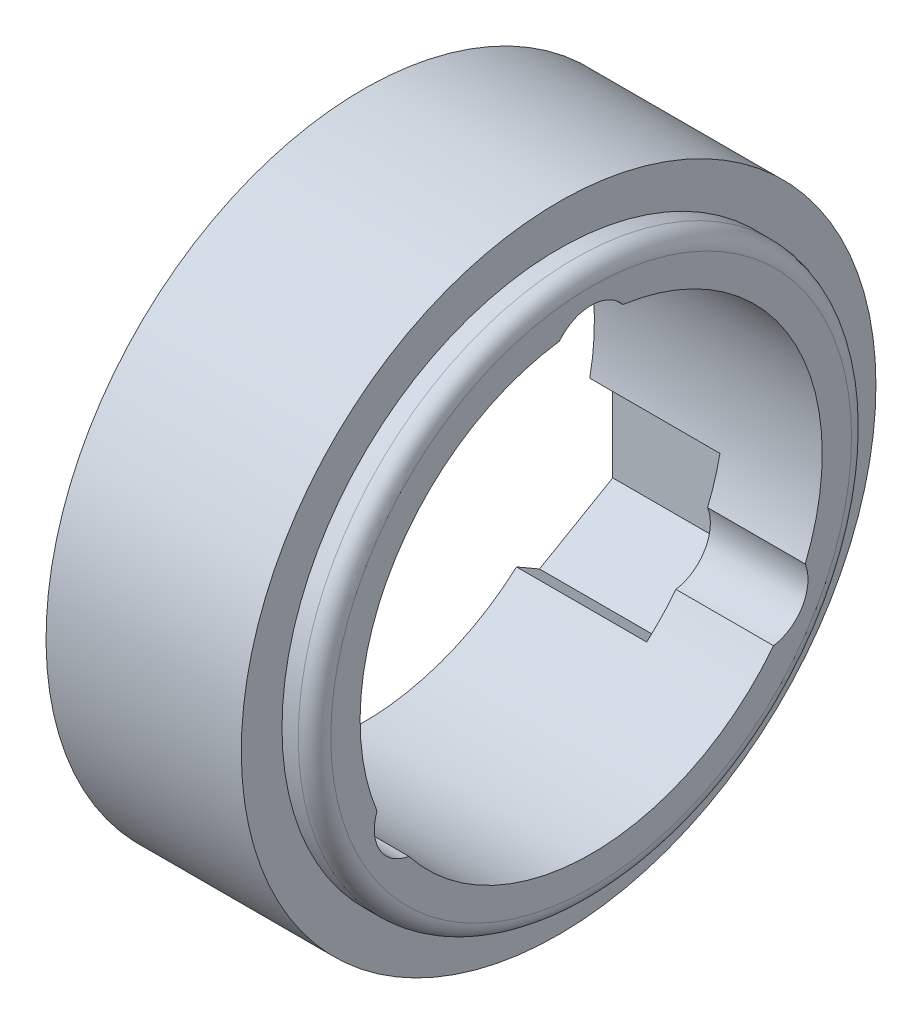
ISO-10303-21;
HEADER;
FILE_DESCRIPTION(('STEP AP214'),'2;1');
FILE_NAME('part.step','',(''),(''),'','','');
FILE_SCHEMA(('AUTOMOTIVE_DESIGN { 1 0 10303 214 1 1 1 1 }'));
ENDSEC;
DATA;
#1=APPLICATION_CONTEXT('core data for automotive mechanical design processes');
#2=APPLICATION_PROTOCOL_DEFINITION('international standard','automotive_design',2000,#1);
#3=PRODUCT_CONTEXT('',#1,'mechanical');
#4=PRODUCT('Part','Part','',(#3));
#5=PRODUCT_RELATED_PRODUCT_CATEGORY('part','',(#4));
#6=PRODUCT_DEFINITION_FORMATION('','',#4);
#7=PRODUCT_DEFINITION_CONTEXT('part definition',#1,'design');
#8=PRODUCT_DEFINITION('design','',#6,#7);
#9=PRODUCT_DEFINITION_SHAPE('','',#8);
#10=(LENGTH_UNIT() NAMED_UNIT(*) SI_UNIT(.MILLI.,.METRE.));
#11=(NAMED_UNIT(*) PLANE_ANGLE_UNIT() SI_UNIT($,.RADIAN.));
#12=(NAMED_UNIT(*) SI_UNIT($,.STERADIAN.) SOLID_ANGLE_UNIT());
#13=UNCERTAINTY_MEASURE_WITH_UNIT(LENGTH_MEASURE(1.E-05),#10,'distance_accuracy_value','');
#14=(GEOMETRIC_REPRESENTATION_CONTEXT(3) GLOBAL_UNCERTAINTY_ASSIGNED_CONTEXT((#13)) GLOBAL_UNIT_ASSIGNED_CONTEXT((#10,
#11,#12)) REPRESENTATION_CONTEXT('',''));
#15=CARTESIAN_POINT('',(0.,0.,0.));
#16=DIRECTION('',(0.,0.,1.));
#17=DIRECTION('',(1.,0.,0.));
#18=AXIS2_PLACEMENT_3D('',#15,#16,#17);
#19=CARTESIAN_POINT('',(97.,16.,-3.));
#20=DIRECTION('',(-1.,0.,0.));
#21=DIRECTION('',(0.,0.,1.));
#22=AXIS2_PLACEMENT_3D('',#19,#20,#21);
#23=CYLINDRICAL_SURFACE('',#22,8.5);
#24=CARTESIAN_POINT('',(96.,16.,-3.));
#25=DIRECTION('',(-1.,0.,0.));
#26=DIRECTION('',(0.,0.,1.));
#27=AXIS2_PLACEMENT_3D('',#24,#25,#26);
#28=CIRCLE('',#27,8.5);
#29=CARTESIAN_POINT('',(96.,16.,-11.5));
#30=VERTEX_POINT('',#29);
#31=EDGE_CURVE('E272',#30,#30,#28,.T.);
#32=ORIENTED_EDGE('',*,*,#31,.F.);
#33=DIRECTION('',(1.,0.,0.));
#34=VECTOR('',#33,1.);
#35=CARTESIAN_POINT('',(97.,16.,-11.5));
#36=LINE('',#35,#34);
#37=CARTESIAN_POINT('',(96.5,16.,-11.5));
#38=VERTEX_POINT('',#37);
#39=EDGE_CURVE('E10',#30,#38,#36,.T.);
#40=ORIENTED_EDGE('',*,*,#39,.T.);
#41=CARTESIAN_POINT('',(96.5,16.,-3.));
#42=DIRECTION('',(1.,0.,0.));
#43=DIRECTION('',(0.,0.,1.));
#44=AXIS2_PLACEMENT_3D('',#41,#42,#43);
#45=CIRCLE('',#44,8.5);
#46=EDGE_CURVE('E271',#38,#38,#45,.T.);
#47=ORIENTED_EDGE('',*,*,#46,.F.);
#48=ORIENTED_EDGE('',*,*,#39,.F.);
#49=EDGE_LOOP('',(#32,#40,#47,#48));
#50=FACE_BOUND('',#49,.T.);
#51=ADVANCED_FACE('F16',(#50),#23,.T.);
#52=CARTESIAN_POINT('',(96.5,16.,-3.));
#53=DIRECTION('',(-1.,0.,0.));
#54=DIRECTION('',(0.,0.,1.));
#55=AXIS2_PLACEMENT_3D('',#52,#53,#54);
#56=TOROIDAL_SURFACE('',#55,8.,0.5);
#57=ORIENTED_EDGE('',*,*,#46,.T.);
#58=CARTESIAN_POINT('',(96.5,16.,-11.));
#59=DIRECTION('',(0.,-1.,0.));
#60=DIRECTION('',(0.,0.,-1.));
#61=AXIS2_PLACEMENT_3D('',#58,#59,#60);
#62=CIRCLE('',#61,0.5);
#63=CARTESIAN_POINT('',(97.,16.,-11.));
#64=VERTEX_POINT('',#63);
#65=EDGE_CURVE('E27',#38,#64,#62,.T.);
#66=ORIENTED_EDGE('',*,*,#65,.T.);
#67=CARTESIAN_POINT('',(97.,16.,-3.));
#68=DIRECTION('',(-1.,0.,0.));
#69=DIRECTION('',(0.,0.,1.));
#70=AXIS2_PLACEMENT_3D('',#67,#68,#69);
#71=CIRCLE('',#70,8.);
#72=EDGE_CURVE('E359',#64,#64,#71,.T.);
#73=ORIENTED_EDGE('',*,*,#72,.T.);
#74=ORIENTED_EDGE('',*,*,#65,.F.);
#75=EDGE_LOOP('',(#57,#66,#73,#74));
#76=FACE_BOUND('',#75,.T.);
#77=ADVANCED_FACE('F553',(#76),#56,.T.);
#78=CARTESIAN_POINT('',(96.,16.,-3.));
#79=DIRECTION('',(-1.,0.,0.));
#80=DIRECTION('',(0.,-0.978362824766285,0.206896551724132));
#81=AXIS2_PLACEMENT_3D('',#78,#79,#80);
#82=CYLINDRICAL_SURFACE('',#81,9.74999999999989);
#83=CARTESIAN_POINT('',(90.,16.,-3.));
#84=DIRECTION('',(-1.,0.,0.));
#85=DIRECTION('',(0.,-0.978362824766285,0.206896551724132));
#86=AXIS2_PLACEMENT_3D('',#83,#84,#85);
#87=CIRCLE('',#86,9.74999999999989);
#88=CARTESIAN_POINT('',(90.,25.122543751513,0.441176470588228));
#89=VERTEX_POINT('',#88);
#90=CARTESIAN_POINT('',(90.,25.5390375414712,-5.01724137931027));
#91=VERTEX_POINT('',#90);
#92=EDGE_CURVE('E266',#89,#91,#87,.T.);
#93=ORIENTED_EDGE('',*,*,#92,.F.);
#94=CARTESIAN_POINT('',(90.,16.,-3.));
#95=DIRECTION('',(-1.,0.,0.));
#96=DIRECTION('',(0.,-0.978362824766285,0.206896551724132));
#97=AXIS2_PLACEMENT_3D('',#94,#95,#96);
#98=CIRCLE('',#97,9.74999999999989);
#99=EDGE_CURVE('E274',#91,#89,#98,.T.);
#100=ORIENTED_EDGE('',*,*,#99,.F.);
#101=DIRECTION('',(1.,0.,0.));
#102=VECTOR('',#101,1.);
#103=CARTESIAN_POINT('',(96.,25.5390375414712,-5.01724137931027));
#104=LINE('',#103,#102);
#105=CARTESIAN_POINT('',(96.,25.5390375414712,-5.01724137931027));
#106=VERTEX_POINT('',#105);
#107=EDGE_CURVE('E262',#91,#106,#104,.T.);
#108=ORIENTED_EDGE('',*,*,#107,.T.);
#109=CARTESIAN_POINT('',(96.,16.,-3.));
#110=DIRECTION('',(-1.,0.,0.));
#111=DIRECTION('',(0.,-0.978362824766285,0.206896551724132));
#112=AXIS2_PLACEMENT_3D('',#109,#110,#111);
#113=CIRCLE('',#112,9.74999999999989);
#114=CARTESIAN_POINT('',(96.,25.122543751513,0.441176470588228));
#115=VERTEX_POINT('',#114);
#116=EDGE_CURVE('E308',#106,#115,#113,.T.);
#117=ORIENTED_EDGE('',*,*,#116,.T.);
#118=CARTESIAN_POINT('',(96.,16.,-3.));
#119=DIRECTION('',(-1.,0.,0.));
#120=DIRECTION('',(0.,-0.978362824766285,0.206896551724132));
#121=AXIS2_PLACEMENT_3D('',#118,#119,#120);
#122=CIRCLE('',#121,9.74999999999989);
#123=EDGE_CURVE('E268',#115,#106,#122,.T.);
#124=ORIENTED_EDGE('',*,*,#123,.T.);
#125=ORIENTED_EDGE('',*,*,#107,.F.);
#126=EDGE_LOOP('',(#93,#100,#108,#117,#124,#125));
#127=FACE_BOUND('',#126,.T.);
#128=ADVANCED_FACE('F264',(#127),#82,.T.);
#129=CARTESIAN_POINT('',(96.,16.,-3.));
#130=DIRECTION('',(-1.,0.,0.));
#131=DIRECTION('',(0.,1.,0.));
#132=AXIS2_PLACEMENT_3D('',#129,#130,#131);
#133=PLANE('',#132);
#134=ORIENTED_EDGE('',*,*,#31,.T.);
#135=EDGE_LOOP('',(#134));
#136=FACE_BOUND('',#135,.T.);
#137=ORIENTED_EDGE('',*,*,#123,.F.);
#138=ORIENTED_EDGE('',*,*,#116,.F.);
#139=EDGE_LOOP('',(#137,#138));
#140=FACE_BOUND('',#139,.T.);
#141=ADVANCED_FACE('F609',(#136,#140),#133,.F.);
#142=CARTESIAN_POINT('',(94.,22.25,-3.));
#143=DIRECTION('',(-1.,0.,0.));
#144=DIRECTION('',(0.,0.,1.));
#145=AXIS2_PLACEMENT_3D('',#142,#143,#144);
#146=PLANE('',#145);
#147=CARTESIAN_POINT('',(94.,16.,-3.));
#148=DIRECTION('',(1.,0.,0.));
#149=DIRECTION('',(0.,0.,-1.));
#150=AXIS2_PLACEMENT_3D('',#147,#148,#149);
#151=CIRCLE('',#150,7.1);
#152=CARTESIAN_POINT('',(94.,22.7340552418287,-5.25));
#153=VERTEX_POINT('',#152);
#154=CARTESIAN_POINT('',(94.,23.0328,-3.97453792127345));
#155=VERTEX_POINT('',#154);
#156=EDGE_CURVE('E464',#153,#155,#151,.T.);
#157=ORIENTED_EDGE('',*,*,#156,.T.);
#158=CARTESIAN_POINT('',(94.,22.25,-3.));
#159=DIRECTION('',(1.,0.,0.));
#160=DIRECTION('',(0.,0.,1.));
#161=AXIS2_PLACEMENT_3D('',#158,#159,#160);
#162=CIRCLE('',#161,1.25);
#163=CARTESIAN_POINT('',(94.,23.0328,-2.02546207872654));
#164=VERTEX_POINT('',#163);
#165=EDGE_CURVE('E287',#155,#164,#162,.T.);
#166=ORIENTED_EDGE('',*,*,#165,.T.);
#167=CARTESIAN_POINT('',(94.,16.,-3.));
#168=DIRECTION('',(1.,0.,0.));
#169=DIRECTION('',(0.,0.,-1.));
#170=AXIS2_PLACEMENT_3D('',#167,#168,#169);
#171=CIRCLE('',#170,7.1);
#172=CARTESIAN_POINT('',(94.,22.7340552418287,-0.75));
#173=VERTEX_POINT('',#172);
#174=EDGE_CURVE('E291',#164,#173,#171,.T.);
#175=ORIENTED_EDGE('',*,*,#174,.T.);
#176=DIRECTION('',(0.,1.,0.));
#177=VECTOR('',#176,1.);
#178=CARTESIAN_POINT('',(94.,20.9509618943234,-0.75));
#179=LINE('',#178,#177);
#180=CARTESIAN_POINT('',(94.,23.5490381056767,-0.75));
#181=VERTEX_POINT('',#180);
#182=EDGE_CURVE('E241',#173,#181,#179,.T.);
#183=ORIENTED_EDGE('',*,*,#182,.T.);
#184=DIRECTION('',(0.,0.5,-0.866025403784439));
#185=VECTOR('',#184,1.);
#186=CARTESIAN_POINT('',(94.,23.5490381056767,-0.75));
#187=LINE('',#186,#185);
#188=CARTESIAN_POINT('',(94.,24.8480762113533,-3.));
#189=VERTEX_POINT('',#188);
#190=EDGE_CURVE('E172',#181,#189,#187,.T.);
#191=ORIENTED_EDGE('',*,*,#190,.T.);
#192=DIRECTION('',(0.,-0.5,-0.866025403784438));
#193=VECTOR('',#192,1.);
#194=CARTESIAN_POINT('',(94.,24.8480762113533,-3.));
#195=LINE('',#194,#193);
#196=CARTESIAN_POINT('',(94.,23.5490381056767,-5.25));
#197=VERTEX_POINT('',#196);
#198=EDGE_CURVE('E385',#189,#197,#195,.T.);
#199=ORIENTED_EDGE('',*,*,#198,.T.);
#200=DIRECTION('',(0.,-1.,0.));
#201=VECTOR('',#200,1.);
#202=CARTESIAN_POINT('',(94.,23.5490381056767,-5.25));
#203=LINE('',#202,#201);
#204=EDGE_CURVE('E390',#197,#153,#203,.T.);
#205=ORIENTED_EDGE('',*,*,#204,.T.);
#206=EDGE_LOOP('',(#157,#166,#175,#183,#191,#199,#205));
#207=FACE_BOUND('',#206,.T.);
#208=ADVANCED_FACE('F548',(#207),#146,.T.);
#209=CARTESIAN_POINT('',(94.,23.5490381056767,-0.75));
#210=DIRECTION('',(0.,0.866025403784439,0.5));
#211=DIRECTION('',(1.,0.,0.));
#212=AXIS2_PLACEMENT_3D('',#209,#210,#211);
#213=PLANE('',#212);
#214=ORIENTED_EDGE('',*,*,#190,.F.);
#215=DIRECTION('',(-1.,0.,0.));
#216=VECTOR('',#215,1.);
#217=CARTESIAN_POINT('',(94.,23.5490381056767,-0.75));
#218=LINE('',#217,#216);
#219=CARTESIAN_POINT('',(90.,23.5490381056767,-0.75));
#220=VERTEX_POINT('',#219);
#221=EDGE_CURVE('E395',#181,#220,#218,.T.);
#222=ORIENTED_EDGE('',*,*,#221,.T.);
#223=DIRECTION('',(0.,-0.5,0.866025403784439));
#224=VECTOR('',#223,1.);
#225=CARTESIAN_POINT('',(90.,23.0925476320959,0.0406646934131864));
#226=LINE('',#225,#224);
#227=CARTESIAN_POINT('',(90.,24.8480762113533,-3.));
#228=VERTEX_POINT('',#227);
#229=EDGE_CURVE('E319',#228,#220,#226,.T.);
#230=ORIENTED_EDGE('',*,*,#229,.F.);
#231=DIRECTION('',(-1.,0.,0.));
#232=VECTOR('',#231,1.);
#233=CARTESIAN_POINT('',(94.,24.8480762113533,-3.));
#234=LINE('',#233,#232);
#235=EDGE_CURVE('E388',#189,#228,#234,.T.);
#236=ORIENTED_EDGE('',*,*,#235,.F.);
#237=EDGE_LOOP('',(#214,#222,#230,#236));
#238=FACE_BOUND('',#237,.T.);
#239=ADVANCED_FACE('F538',(#238),#213,.F.);
#240=CARTESIAN_POINT('',(94.,24.8480762113533,-3.));
#241=DIRECTION('',(0.,0.866025403784438,-0.5));
#242=DIRECTION('',(-1.,0.,0.));
#243=AXIS2_PLACEMENT_3D('',#240,#241,#242);
#244=PLANE('',#243);
#245=ORIENTED_EDGE('',*,*,#198,.F.);
#246=ORIENTED_EDGE('',*,*,#235,.T.);
#247=DIRECTION('',(0.,0.5,0.866025403784438));
#248=VECTOR('',#247,1.);
#249=CARTESIAN_POINT('',(90.,23.7420666849342,-4.91566469341318));
#250=LINE('',#249,#248);
#251=CARTESIAN_POINT('',(90.,23.5490381056767,-5.25));
#252=VERTEX_POINT('',#251);
#253=EDGE_CURVE('E323',#252,#228,#250,.T.);
#254=ORIENTED_EDGE('',*,*,#253,.F.);
#255=DIRECTION('',(-1.,0.,0.));
#256=VECTOR('',#255,1.);
#257=CARTESIAN_POINT('',(94.,23.5490381056767,-5.25));
#258=LINE('',#257,#256);
#259=EDGE_CURVE('E389',#197,#252,#258,.T.);
#260=ORIENTED_EDGE('',*,*,#259,.F.);
#261=EDGE_LOOP('',(#245,#246,#254,#260));
#262=FACE_BOUND('',#261,.T.);
#263=ADVANCED_FACE('F536',(#262),#244,.F.);
#264=CARTESIAN_POINT('',(94.,23.5490381056767,-5.25));
#265=DIRECTION('',(0.,0.,-1.));
#266=DIRECTION('',(0.,-1.,0.));
#267=AXIS2_PLACEMENT_3D('',#264,#265,#266);
#268=PLANE('',#267);
#269=DIRECTION('',(1.,0.,0.));
#270=VECTOR('',#269,1.);
#271=CARTESIAN_POINT('',(97.,22.7340552418287,-5.25));
#272=LINE('',#271,#270);
#273=CARTESIAN_POINT('',(90.,22.7340552418287,-5.25));
#274=VERTEX_POINT('',#273);
#275=EDGE_CURVE('E412',#274,#153,#272,.T.);
#276=ORIENTED_EDGE('',*,*,#275,.T.);
#277=ORIENTED_EDGE('',*,*,#204,.F.);
#278=ORIENTED_EDGE('',*,*,#259,.T.);
#279=DIRECTION('',(0.,1.,0.));
#280=VECTOR('',#279,1.);
#281=CARTESIAN_POINT('',(90.,19.7745190528384,-5.25));
#282=LINE('',#281,#280);
#283=EDGE_CURVE('E277',#274,#252,#282,.T.);
#284=ORIENTED_EDGE('',*,*,#283,.F.);
#285=EDGE_LOOP('',(#276,#277,#278,#284));
#286=FACE_BOUND('',#285,.T.);
#287=ADVANCED_FACE('F532',(#286),#268,.F.);
#288=CARTESIAN_POINT('',(94.,12.875,2.41265877365274));
#289=DIRECTION('',(-1.,0.,0.));
#290=DIRECTION('',(0.,0.,1.));
#291=AXIS2_PLACEMENT_3D('',#288,#289,#290);
#292=PLANE('',#291);
#293=CARTESIAN_POINT('',(94.,16.,-3.));
#294=DIRECTION('',(1.,0.,0.));
#295=DIRECTION('',(0.,0.,-1.));
#296=AXIS2_PLACEMENT_3D('',#293,#294,#295);
#297=CIRCLE('',#296,7.1);
#298=CARTESIAN_POINT('',(94.,14.5815295376007,3.95686290991138));
#299=VERTEX_POINT('',#298);
#300=CARTESIAN_POINT('',(94.,13.3275745967741,3.57785242037193));
#301=VERTEX_POINT('',#300);
#302=EDGE_CURVE('E372',#299,#301,#297,.T.);
#303=ORIENTED_EDGE('',*,*,#302,.T.);
#304=CARTESIAN_POINT('',(94.,12.875,2.41265877365274));
#305=DIRECTION('',(1.,0.,0.));
#306=DIRECTION('',(0.,0.,1.));
#307=AXIS2_PLACEMENT_3D('',#304,#305,#306);
#308=CIRCLE('',#307,1.25);
#309=CARTESIAN_POINT('',(94.,11.6396254032259,2.60331449909847));
#310=VERTEX_POINT('',#309);
#311=EDGE_CURVE('E281',#301,#310,#308,.T.);
#312=ORIENTED_EDGE('',*,*,#311,.T.);
#313=CARTESIAN_POINT('',(94.,16.,-3.));
#314=DIRECTION('',(1.,0.,0.));
#315=DIRECTION('',(0.,0.,-1.));
#316=AXIS2_PLACEMENT_3D('',#313,#314,#315);
#317=CIRCLE('',#316,7.1);
#318=CARTESIAN_POINT('',(94.,10.6844152205707,1.70686290991138));
#319=VERTEX_POINT('',#318);
#320=EDGE_CURVE('E349',#310,#319,#317,.T.);
#321=ORIENTED_EDGE('',*,*,#320,.T.);
#322=DIRECTION('',(0.,-0.5,0.866025403784439));
#323=VECTOR('',#322,1.);
#324=CARTESIAN_POINT('',(94.,11.5759618943234,0.16265877365274));
#325=LINE('',#324,#323);
#326=CARTESIAN_POINT('',(94.,10.2769237886467,2.41265877365274));
#327=VERTEX_POINT('',#326);
#328=EDGE_CURVE('E306',#319,#327,#325,.T.);
#329=ORIENTED_EDGE('',*,*,#328,.T.);
#330=DIRECTION('',(0.,0.5,0.866025403784439));
#331=VECTOR('',#330,1.);
#332=CARTESIAN_POINT('',(94.,10.2769237886467,2.41265877365274));
#333=LINE('',#332,#331);
#334=CARTESIAN_POINT('',(94.,11.5759618943234,4.66265877365274));
#335=VERTEX_POINT('',#334);
#336=EDGE_CURVE('E197',#327,#335,#333,.T.);
#337=ORIENTED_EDGE('',*,*,#336,.T.);
#338=DIRECTION('',(0.,1.,0.));
#339=VECTOR('',#338,1.);
#340=CARTESIAN_POINT('',(94.,11.5759618943234,4.66265877365274));
#341=LINE('',#340,#339);
#342=CARTESIAN_POINT('',(94.,14.1740381056767,4.66265877365274));
#343=VERTEX_POINT('',#342);
#344=EDGE_CURVE('E314',#335,#343,#341,.T.);
#345=ORIENTED_EDGE('',*,*,#344,.T.);
#346=DIRECTION('',(0.,0.5,-0.866025403784439));
#347=VECTOR('',#346,1.);
#348=CARTESIAN_POINT('',(94.,14.1740381056767,4.66265877365274));
#349=LINE('',#348,#347);
#350=EDGE_CURVE('E368',#343,#299,#349,.T.);
#351=ORIENTED_EDGE('',*,*,#350,.T.);
#352=EDGE_LOOP('',(#303,#312,#321,#329,#337,#345,#351));
#353=FACE_BOUND('',#352,.T.);
#354=ADVANCED_FACE('F546',(#353),#292,.T.);
#355=CARTESIAN_POINT('',(94.,10.2769237886467,2.41265877365274));
#356=DIRECTION('',(0.,-0.866025403784439,0.5));
#357=DIRECTION('',(-1.,0.,0.));
#358=AXIS2_PLACEMENT_3D('',#355,#356,#357);
#359=PLANE('',#358);
#360=ORIENTED_EDGE('',*,*,#336,.F.);
#361=DIRECTION('',(-1.,0.,0.));
#362=VECTOR('',#361,1.);
#363=CARTESIAN_POINT('',(94.,10.2769237886467,2.41265877365274));
#364=LINE('',#363,#362);
#365=CARTESIAN_POINT('',(90.,10.2769237886467,2.41265877365274));
#366=VERTEX_POINT('',#365);
#367=EDGE_CURVE('E303',#327,#366,#364,.T.);
#368=ORIENTED_EDGE('',*,*,#367,.T.);
#369=DIRECTION('',(0.,-0.5,-0.866025403784439));
#370=VECTOR('',#369,1.);
#371=CARTESIAN_POINT('',(90.,9.82043331506588,1.62199408023955));
#372=LINE('',#371,#370);
#373=CARTESIAN_POINT('',(90.,11.5759618943234,4.66265877365274));
#374=VERTEX_POINT('',#373);
#375=EDGE_CURVE('E211',#374,#366,#372,.T.);
#376=ORIENTED_EDGE('',*,*,#375,.F.);
#377=DIRECTION('',(-1.,0.,0.));
#378=VECTOR('',#377,1.);
#379=CARTESIAN_POINT('',(94.,11.5759618943234,4.66265877365274));
#380=LINE('',#379,#378);
#381=EDGE_CURVE('E311',#335,#374,#380,.T.);
#382=ORIENTED_EDGE('',*,*,#381,.F.);
#383=EDGE_LOOP('',(#360,#368,#376,#382));
#384=FACE_BOUND('',#383,.T.);
#385=ADVANCED_FACE('F599',(#384),#359,.F.);
#386=CARTESIAN_POINT('',(94.,11.5759618943234,4.66265877365274));
#387=DIRECTION('',(0.,0.,1.));
#388=DIRECTION('',(0.,-1.,0.));
#389=AXIS2_PLACEMENT_3D('',#386,#387,#388);
#390=PLANE('',#389);
#391=ORIENTED_EDGE('',*,*,#344,.F.);
#392=ORIENTED_EDGE('',*,*,#381,.T.);
#393=DIRECTION('',(0.,-1.,0.));
#394=VECTOR('',#393,1.);
#395=CARTESIAN_POINT('',(90.,13.7879809471617,4.66265877365274));
#396=LINE('',#395,#394);
#397=CARTESIAN_POINT('',(90.,14.1740381056767,4.66265877365274));
#398=VERTEX_POINT('',#397);
#399=EDGE_CURVE('E353',#398,#374,#396,.T.);
#400=ORIENTED_EDGE('',*,*,#399,.F.);
#401=DIRECTION('',(-1.,0.,0.));
#402=VECTOR('',#401,1.);
#403=CARTESIAN_POINT('',(94.,14.1740381056767,4.66265877365274));
#404=LINE('',#403,#402);
#405=EDGE_CURVE('E365',#343,#398,#404,.T.);
#406=ORIENTED_EDGE('',*,*,#405,.F.);
#407=EDGE_LOOP('',(#391,#392,#400,#406));
#408=FACE_BOUND('',#407,.T.);
#409=ADVANCED_FACE('F602',(#408),#390,.F.);
#410=CARTESIAN_POINT('',(94.,14.1740381056767,4.66265877365274));
#411=DIRECTION('',(0.,0.866025403784439,0.5));
#412=DIRECTION('',(1.,0.,0.));
#413=AXIS2_PLACEMENT_3D('',#410,#411,#412);
#414=PLANE('',#413);
#415=DIRECTION('',(1.,0.,0.));
#416=VECTOR('',#415,1.);
#417=CARTESIAN_POINT('',(97.,14.5815295376007,3.95686290991138));
#418=LINE('',#417,#416);
#419=CARTESIAN_POINT('',(90.,14.5815295376007,3.95686290991138));
#420=VERTEX_POINT('',#419);
#421=EDGE_CURVE('E300',#420,#299,#418,.T.);
#422=ORIENTED_EDGE('',*,*,#421,.T.);
#423=ORIENTED_EDGE('',*,*,#350,.F.);
#424=ORIENTED_EDGE('',*,*,#405,.T.);
#425=DIRECTION('',(0.,-0.5,0.866025403784439));
#426=VECTOR('',#425,1.);
#427=CARTESIAN_POINT('',(90.,16.0612976320959,1.39382938682637));
#428=LINE('',#427,#426);
#429=EDGE_CURVE('E322',#420,#398,#428,.T.);
#430=ORIENTED_EDGE('',*,*,#429,.F.);
#431=EDGE_LOOP('',(#422,#423,#424,#430));
#432=FACE_BOUND('',#431,.T.);
#433=ADVANCED_FACE('F622',(#432),#414,.F.);
#434=CARTESIAN_POINT('',(94.,14.1740381056767,-10.6626587736527));
#435=DIRECTION('',(0.,0.,-1.));
#436=DIRECTION('',(0.,-1.,0.));
#437=AXIS2_PLACEMENT_3D('',#434,#435,#436);
#438=PLANE('',#437);
#439=DIRECTION('',(0.,-1.,0.));
#440=VECTOR('',#439,1.);
#441=CARTESIAN_POINT('',(94.,14.1740381056767,-10.6626587736527));
#442=LINE('',#441,#440);
#443=CARTESIAN_POINT('',(94.,14.1740381056767,-10.6626587736527));
#444=VERTEX_POINT('',#443);
#445=CARTESIAN_POINT('',(94.,11.5759618943234,-10.6626587736527));
#446=VERTEX_POINT('',#445);
#447=EDGE_CURVE('E334',#444,#446,#442,.T.);
#448=ORIENTED_EDGE('',*,*,#447,.F.);
#449=DIRECTION('',(-1.,0.,0.));
#450=VECTOR('',#449,1.);
#451=CARTESIAN_POINT('',(94.,14.1740381056767,-10.6626587736527));
#452=LINE('',#451,#450);
#453=CARTESIAN_POINT('',(90.,14.1740381056767,-10.6626587736527));
#454=VERTEX_POINT('',#453);
#455=EDGE_CURVE('E423',#444,#454,#452,.T.);
#456=ORIENTED_EDGE('',*,*,#455,.T.);
#457=DIRECTION('',(0.,1.,0.));
#458=VECTOR('',#457,1.);
#459=CARTESIAN_POINT('',(90.,15.0870190528384,-10.6626587736527));
#460=LINE('',#459,#458);
#461=CARTESIAN_POINT('',(90.,11.5759618943234,-10.6626587736527));
#462=VERTEX_POINT('',#461);
#463=EDGE_CURVE('E376',#462,#454,#460,.T.);
#464=ORIENTED_EDGE('',*,*,#463,.F.);
#465=DIRECTION('',(-1.,0.,0.));
#466=VECTOR('',#465,1.);
#467=CARTESIAN_POINT('',(94.,11.5759618943234,-10.6626587736527));
#468=LINE('',#467,#466);
#469=EDGE_CURVE('E433',#446,#462,#468,.T.);
#470=ORIENTED_EDGE('',*,*,#469,.F.);
#471=EDGE_LOOP('',(#448,#456,#464,#470));
#472=FACE_BOUND('',#471,.T.);
#473=ADVANCED_FACE('F624',(#472),#438,.F.);
#474=CARTESIAN_POINT('',(94.,11.5759618943234,-10.6626587736527));
#475=DIRECTION('',(0.,-0.866025403784439,-0.5));
#476=DIRECTION('',(0.,0.5,-0.866025403784439));
#477=AXIS2_PLACEMENT_3D('',#474,#475,#476);
#478=PLANE('',#477);
#479=DIRECTION('',(0.,-0.5,0.866025403784439));
#480=VECTOR('',#479,1.);
#481=CARTESIAN_POINT('',(94.,11.5759618943234,-10.6626587736527));
#482=LINE('',#481,#480);
#483=CARTESIAN_POINT('',(94.,10.2769237886467,-8.41265877365273));
#484=VERTEX_POINT('',#483);
#485=EDGE_CURVE('E329',#446,#484,#482,.T.);
#486=ORIENTED_EDGE('',*,*,#485,.F.);
#487=ORIENTED_EDGE('',*,*,#469,.T.);
#488=DIRECTION('',(0.,0.5,-0.866025403784439));
#489=VECTOR('',#488,1.);
#490=CARTESIAN_POINT('',(90.,10.4699523679042,-8.74699408023955));
#491=LINE('',#490,#489);
#492=CARTESIAN_POINT('',(90.,10.2769237886467,-8.41265877365273));
#493=VERTEX_POINT('',#492);
#494=EDGE_CURVE('E380',#493,#462,#491,.T.);
#495=ORIENTED_EDGE('',*,*,#494,.F.);
#496=DIRECTION('',(-1.,0.,0.));
#497=VECTOR('',#496,1.);
#498=CARTESIAN_POINT('',(94.,10.2769237886467,-8.41265877365273));
#499=LINE('',#498,#497);
#500=EDGE_CURVE('E379',#484,#493,#499,.T.);
#501=ORIENTED_EDGE('',*,*,#500,.F.);
#502=EDGE_LOOP('',(#486,#487,#495,#501));
#503=FACE_BOUND('',#502,.T.);
#504=ADVANCED_FACE('F597',(#503),#478,.F.);
#505=CARTESIAN_POINT('',(94.,10.2769237886467,-8.41265877365273));
#506=DIRECTION('',(0.,-0.866025403784439,0.5));
#507=DIRECTION('',(-1.,0.,0.));
#508=AXIS2_PLACEMENT_3D('',#505,#506,#507);
#509=PLANE('',#508);
#510=DIRECTION('',(1.,0.,0.));
#511=VECTOR('',#510,1.);
#512=CARTESIAN_POINT('',(97.,10.6844152205707,-7.70686290991138));
#513=LINE('',#512,#511);
#514=CARTESIAN_POINT('',(90.,10.6844152205707,-7.70686290991138));
#515=VERTEX_POINT('',#514);
#516=CARTESIAN_POINT('',(94.,10.6844152205707,-7.70686290991138));
#517=VERTEX_POINT('',#516);
#518=EDGE_CURVE('E403',#515,#517,#513,.T.);
#519=ORIENTED_EDGE('',*,*,#518,.T.);
#520=DIRECTION('',(0.,0.5,0.866025403784439));
#521=VECTOR('',#520,1.);
#522=CARTESIAN_POINT('',(94.,10.2769237886467,-8.41265877365273));
#523=LINE('',#522,#521);
#524=EDGE_CURVE('E333',#484,#517,#523,.T.);
#525=ORIENTED_EDGE('',*,*,#524,.F.);
#526=ORIENTED_EDGE('',*,*,#500,.T.);
#527=DIRECTION('',(0.,-0.5,-0.866025403784439));
#528=VECTOR('',#527,1.);
#529=CARTESIAN_POINT('',(90.,12.1641833150659,-5.14382938682636));
#530=LINE('',#529,#528);
#531=EDGE_CURVE('E398',#515,#493,#530,.T.);
#532=ORIENTED_EDGE('',*,*,#531,.F.);
#533=EDGE_LOOP('',(#519,#525,#526,#532));
#534=FACE_BOUND('',#533,.T.);
#535=ADVANCED_FACE('F569',(#534),#509,.F.);
#536=CARTESIAN_POINT('',(90.,16.,-3.));
#537=DIRECTION('',(-1.,0.,0.));
#538=DIRECTION('',(0.,1.,0.));
#539=AXIS2_PLACEMENT_3D('',#536,#537,#538);
#540=PLANE('',#539);
#541=CARTESIAN_POINT('',(90.,16.,-3.));
#542=DIRECTION('',(1.,0.,0.));
#543=DIRECTION('',(0.,0.,-1.));
#544=AXIS2_PLACEMENT_3D('',#541,#542,#543);
#545=CIRCLE('',#544,7.1);
#546=CARTESIAN_POINT('',(90.,14.5815295376007,-9.95686290991138));
#547=VERTEX_POINT('',#546);
#548=EDGE_CURVE('E346',#547,#274,#545,.T.);
#549=ORIENTED_EDGE('',*,*,#548,.T.);
#550=ORIENTED_EDGE('',*,*,#283,.T.);
#551=ORIENTED_EDGE('',*,*,#253,.T.);
#552=ORIENTED_EDGE('',*,*,#229,.T.);
#553=DIRECTION('',(0.,-1.,0.));
#554=VECTOR('',#553,1.);
#555=CARTESIAN_POINT('',(90.,19.3142683958907,-0.75));
#556=LINE('',#555,#554);
#557=CARTESIAN_POINT('',(90.,22.7340552418287,-0.75));
#558=VERTEX_POINT('',#557);
#559=EDGE_CURVE('E428',#220,#558,#556,.T.);
#560=ORIENTED_EDGE('',*,*,#559,.T.);
#561=CARTESIAN_POINT('',(90.,16.,-3.));
#562=DIRECTION('',(1.,0.,0.));
#563=DIRECTION('',(0.,0.,-1.));
#564=AXIS2_PLACEMENT_3D('',#561,#562,#563);
#565=CIRCLE('',#564,7.1);
#566=EDGE_CURVE('E295',#558,#420,#565,.T.);
#567=ORIENTED_EDGE('',*,*,#566,.T.);
#568=ORIENTED_EDGE('',*,*,#429,.T.);
#569=ORIENTED_EDGE('',*,*,#399,.T.);
#570=ORIENTED_EDGE('',*,*,#375,.T.);
#571=DIRECTION('',(0.,0.5,-0.866025403784439));
#572=VECTOR('',#571,1.);
#573=CARTESIAN_POINT('',(90.,12.3943086435397,-1.25475937419874));
#574=LINE('',#573,#572);
#575=CARTESIAN_POINT('',(90.,10.6844152205707,1.70686290991139));
#576=VERTEX_POINT('',#575);
#577=EDGE_CURVE('E307',#366,#576,#574,.T.);
#578=ORIENTED_EDGE('',*,*,#577,.T.);
#579=CARTESIAN_POINT('',(90.,16.,-3.));
#580=DIRECTION('',(1.,0.,0.));
#581=DIRECTION('',(0.,0.,-1.));
#582=AXIS2_PLACEMENT_3D('',#579,#580,#581);
#583=CIRCLE('',#582,7.1);
#584=EDGE_CURVE('E407',#576,#515,#583,.T.);
#585=ORIENTED_EDGE('',*,*,#584,.T.);
#586=ORIENTED_EDGE('',*,*,#531,.T.);
#587=ORIENTED_EDGE('',*,*,#494,.T.);
#588=ORIENTED_EDGE('',*,*,#463,.T.);
#589=DIRECTION('',(0.,0.5,0.866025403784438));
#590=VECTOR('',#589,1.);
#591=CARTESIAN_POINT('',(90.,16.2914229605697,-6.99524062580126));
#592=LINE('',#591,#590);
#593=EDGE_CURVE('E420',#454,#547,#592,.T.);
#594=ORIENTED_EDGE('',*,*,#593,.T.);
#595=EDGE_LOOP('',(#549,#550,#551,#552,#560,#567,#568,#569,#570,#578,#585,#586,#587,#588,#594));
#596=FACE_BOUND('',#595,.T.);
#597=ORIENTED_EDGE('',*,*,#92,.T.);
#598=ORIENTED_EDGE('',*,*,#99,.T.);
#599=EDGE_LOOP('',(#597,#598));
#600=FACE_BOUND('',#599,.T.);
#601=ADVANCED_FACE('F279',(#596,#600),#540,.T.);
#602=CARTESIAN_POINT('',(90.,12.875,2.41265877365274));
#603=DIRECTION('',(1.,0.,0.));
#604=DIRECTION('',(0.,0.,1.));
#605=AXIS2_PLACEMENT_3D('',#602,#603,#604);
#606=CYLINDRICAL_SURFACE('',#605,1.25);
#607=DIRECTION('',(1.,0.,0.));
#608=VECTOR('',#607,1.);
#609=CARTESIAN_POINT('',(97.,13.3275745967741,3.57785242037193));
#610=LINE('',#609,#608);
#611=CARTESIAN_POINT('',(97.,13.3275745967741,3.57785242037193));
#612=VERTEX_POINT('',#611);
#613=EDGE_CURVE('E327',#301,#612,#610,.T.);
#614=ORIENTED_EDGE('',*,*,#613,.T.);
#615=CARTESIAN_POINT('',(97.,12.875,2.41265877365274));
#616=DIRECTION('',(-1.,0.,0.));
#617=DIRECTION('',(0.,0.,1.));
#618=AXIS2_PLACEMENT_3D('',#615,#616,#617);
#619=CIRCLE('',#618,1.25);
#620=CARTESIAN_POINT('',(97.,11.6396254032259,2.60331449909847));
#621=VERTEX_POINT('',#620);
#622=EDGE_CURVE('E488',#621,#612,#619,.T.);
#623=ORIENTED_EDGE('',*,*,#622,.F.);
#624=DIRECTION('',(-1.,0.,0.));
#625=VECTOR('',#624,1.);
#626=CARTESIAN_POINT('',(97.,11.6396254032259,2.60331449909848));
#627=LINE('',#626,#625);
#628=EDGE_CURVE('E384',#621,#310,#627,.T.);
#629=ORIENTED_EDGE('',*,*,#628,.T.);
#630=ORIENTED_EDGE('',*,*,#311,.F.);
#631=EDGE_LOOP('',(#614,#623,#629,#630));
#632=FACE_BOUND('',#631,.T.);
#633=ADVANCED_FACE('F568',(#632),#606,.F.);
#634=CARTESIAN_POINT('',(90.,22.25,-3.));
#635=DIRECTION('',(1.,0.,0.));
#636=DIRECTION('',(0.,0.,1.));
#637=AXIS2_PLACEMENT_3D('',#634,#635,#636);
#638=CYLINDRICAL_SURFACE('',#637,1.25);
#639=DIRECTION('',(1.,0.,0.));
#640=VECTOR('',#639,1.);
#641=CARTESIAN_POINT('',(97.,23.0328,-3.97453792127345));
#642=LINE('',#641,#640);
#643=CARTESIAN_POINT('',(97.,23.0328,-3.97453792127345));
#644=VERTEX_POINT('',#643);
#645=EDGE_CURVE('E399',#155,#644,#642,.T.);
#646=ORIENTED_EDGE('',*,*,#645,.T.);
#647=CARTESIAN_POINT('',(97.,22.25,-3.));
#648=DIRECTION('',(-1.,0.,0.));
#649=DIRECTION('',(0.,0.,1.));
#650=AXIS2_PLACEMENT_3D('',#647,#648,#649);
#651=CIRCLE('',#650,1.25);
#652=CARTESIAN_POINT('',(97.,23.0328,-2.02546207872654));
#653=VERTEX_POINT('',#652);
#654=EDGE_CURVE('E250',#653,#644,#651,.T.);
#655=ORIENTED_EDGE('',*,*,#654,.F.);
#656=DIRECTION('',(-1.,0.,0.));
#657=VECTOR('',#656,1.);
#658=CARTESIAN_POINT('',(97.,23.0328,-2.02546207872654));
#659=LINE('',#658,#657);
#660=EDGE_CURVE('E328',#653,#164,#659,.T.);
#661=ORIENTED_EDGE('',*,*,#660,.T.);
#662=ORIENTED_EDGE('',*,*,#165,.F.);
#663=EDGE_LOOP('',(#646,#655,#661,#662));
#664=FACE_BOUND('',#663,.T.);
#665=ADVANCED_FACE('F562',(#664),#638,.F.);
#666=CARTESIAN_POINT('',(94.,11.5759618943234,0.16265877365274));
#667=DIRECTION('',(0.,-0.866025403784439,-0.5));
#668=DIRECTION('',(0.,0.5,-0.866025403784439));
#669=AXIS2_PLACEMENT_3D('',#666,#667,#668);
#670=PLANE('',#669);
#671=DIRECTION('',(-1.,0.,0.));
#672=VECTOR('',#671,1.);
#673=CARTESIAN_POINT('',(97.,10.6844152205707,1.70686290991138));
#674=LINE('',#673,#672);
#675=EDGE_CURVE('E424',#319,#576,#674,.T.);
#676=ORIENTED_EDGE('',*,*,#675,.T.);
#677=ORIENTED_EDGE('',*,*,#577,.F.);
#678=ORIENTED_EDGE('',*,*,#367,.F.);
#679=ORIENTED_EDGE('',*,*,#328,.F.);
#680=EDGE_LOOP('',(#676,#677,#678,#679));
#681=FACE_BOUND('',#680,.T.);
#682=ADVANCED_FACE('F501',(#681),#670,.F.);
#683=CARTESIAN_POINT('',(94.,12.875,-8.41265877365273));
#684=DIRECTION('',(-1.,0.,0.));
#685=DIRECTION('',(0.,0.,1.));
#686=AXIS2_PLACEMENT_3D('',#683,#684,#685);
#687=PLANE('',#686);
#688=CARTESIAN_POINT('',(94.,16.,-3.));
#689=DIRECTION('',(1.,0.,0.));
#690=DIRECTION('',(0.,0.,-1.));
#691=AXIS2_PLACEMENT_3D('',#688,#689,#690);
#692=CIRCLE('',#691,7.1);
#693=CARTESIAN_POINT('',(94.,13.3275745967741,-9.57785242037193));
#694=VERTEX_POINT('',#693);
#695=CARTESIAN_POINT('',(94.,14.5815295376007,-9.95686290991138));
#696=VERTEX_POINT('',#695);
#697=EDGE_CURVE('E345',#694,#696,#692,.T.);
#698=ORIENTED_EDGE('',*,*,#697,.T.);
#699=DIRECTION('',(0.,-0.5,-0.866025403784438));
#700=VECTOR('',#699,1.);
#701=CARTESIAN_POINT('',(94.,15.4730762113534,-8.41265877365273));
#702=LINE('',#701,#700);
#703=EDGE_CURVE('E20',#696,#444,#702,.T.);
#704=ORIENTED_EDGE('',*,*,#703,.T.);
#705=ORIENTED_EDGE('',*,*,#447,.T.);
#706=ORIENTED_EDGE('',*,*,#485,.T.);
#707=ORIENTED_EDGE('',*,*,#524,.T.);
#708=CARTESIAN_POINT('',(94.,16.,-3.));
#709=DIRECTION('',(1.,0.,0.));
#710=DIRECTION('',(0.,0.,-1.));
#711=AXIS2_PLACEMENT_3D('',#708,#709,#710);
#712=CIRCLE('',#711,7.1);
#713=CARTESIAN_POINT('',(94.,11.6396254032259,-8.60331449909848));
#714=VERTEX_POINT('',#713);
#715=EDGE_CURVE('E408',#517,#714,#712,.T.);
#716=ORIENTED_EDGE('',*,*,#715,.T.);
#717=CARTESIAN_POINT('',(94.,12.875,-8.41265877365273));
#718=DIRECTION('',(1.,0.,0.));
#719=DIRECTION('',(0.,0.,1.));
#720=AXIS2_PLACEMENT_3D('',#717,#718,#719);
#721=CIRCLE('',#720,1.25);
#722=EDGE_CURVE('E338',#714,#694,#721,.T.);
#723=ORIENTED_EDGE('',*,*,#722,.T.);
#724=EDGE_LOOP('',(#698,#704,#705,#706,#707,#716,#723));
#725=FACE_BOUND('',#724,.T.);
#726=ADVANCED_FACE('F566',(#725),#687,.T.);
#727=CARTESIAN_POINT('',(90.,12.875,-8.41265877365273));
#728=DIRECTION('',(1.,0.,0.));
#729=DIRECTION('',(0.,-0.5,-0.866025403784439));
#730=AXIS2_PLACEMENT_3D('',#727,#728,#729);
#731=CYLINDRICAL_SURFACE('',#730,1.25);
#732=DIRECTION('',(-1.,0.,0.));
#733=VECTOR('',#732,1.);
#734=CARTESIAN_POINT('',(97.,13.3275745967741,-9.57785242037193));
#735=LINE('',#734,#733);
#736=CARTESIAN_POINT('',(97.,13.3275745967741,-9.57785242037193));
#737=VERTEX_POINT('',#736);
#738=EDGE_CURVE('E416',#737,#694,#735,.T.);
#739=ORIENTED_EDGE('',*,*,#738,.T.);
#740=ORIENTED_EDGE('',*,*,#722,.F.);
#741=DIRECTION('',(1.,0.,0.));
#742=VECTOR('',#741,1.);
#743=CARTESIAN_POINT('',(97.,11.6396254032259,-8.60331449909848));
#744=LINE('',#743,#742);
#745=CARTESIAN_POINT('',(97.,11.6396254032259,-8.60331449909848));
#746=VERTEX_POINT('',#745);
#747=EDGE_CURVE('E449',#714,#746,#744,.T.);
#748=ORIENTED_EDGE('',*,*,#747,.T.);
#749=CARTESIAN_POINT('',(97.,12.875,-8.41265877365273));
#750=DIRECTION('',(-1.,0.,0.));
#751=DIRECTION('',(0.,0.,1.));
#752=AXIS2_PLACEMENT_3D('',#749,#750,#751);
#753=CIRCLE('',#752,1.25);
#754=EDGE_CURVE('E362',#737,#746,#753,.T.);
#755=ORIENTED_EDGE('',*,*,#754,.F.);
#756=EDGE_LOOP('',(#739,#740,#748,#755));
#757=FACE_BOUND('',#756,.T.);
#758=ADVANCED_FACE('F18',(#757),#731,.F.);
#759=CARTESIAN_POINT('',(97.,16.,-3.));
#760=DIRECTION('',(-1.,0.,0.));
#761=DIRECTION('',(0.,1.,0.));
#762=AXIS2_PLACEMENT_3D('',#759,#760,#761);
#763=PLANE('',#762);
#764=CARTESIAN_POINT('',(97.,16.,-3.));
#765=DIRECTION('',(-1.,0.,0.));
#766=DIRECTION('',(0.,0.,-1.));
#767=AXIS2_PLACEMENT_3D('',#764,#765,#766);
#768=CIRCLE('',#767,7.1);
#769=EDGE_CURVE('E402',#644,#737,#768,.T.);
#770=ORIENTED_EDGE('',*,*,#769,.T.);
#771=ORIENTED_EDGE('',*,*,#754,.T.);
#772=CARTESIAN_POINT('',(97.,16.,-3.));
#773=DIRECTION('',(-1.,0.,0.));
#774=DIRECTION('',(0.,0.,-1.));
#775=AXIS2_PLACEMENT_3D('',#772,#773,#774);
#776=CIRCLE('',#775,7.1);
#777=EDGE_CURVE('E453',#746,#621,#776,.T.);
#778=ORIENTED_EDGE('',*,*,#777,.T.);
#779=ORIENTED_EDGE('',*,*,#622,.T.);
#780=CARTESIAN_POINT('',(97.,16.,-3.));
#781=DIRECTION('',(-1.,0.,0.));
#782=DIRECTION('',(0.,0.,-1.));
#783=AXIS2_PLACEMENT_3D('',#780,#781,#782);
#784=CIRCLE('',#783,7.1);
#785=EDGE_CURVE('E324',#612,#653,#784,.T.);
#786=ORIENTED_EDGE('',*,*,#785,.T.);
#787=ORIENTED_EDGE('',*,*,#654,.T.);
#788=EDGE_LOOP('',(#770,#771,#778,#779,#786,#787));
#789=FACE_BOUND('',#788,.T.);
#790=ORIENTED_EDGE('',*,*,#72,.F.);
#791=EDGE_LOOP('',(#790));
#792=FACE_BOUND('',#791,.T.);
#793=ADVANCED_FACE('F588',(#789,#792),#763,.F.);
#794=CARTESIAN_POINT('',(94.,20.9509618943234,-0.75));
#795=DIRECTION('',(0.,0.,1.));
#796=DIRECTION('',(0.,-1.,0.));
#797=AXIS2_PLACEMENT_3D('',#794,#795,#796);
#798=PLANE('',#797);
#799=DIRECTION('',(-1.,0.,0.));
#800=VECTOR('',#799,1.);
#801=CARTESIAN_POINT('',(97.,22.7340552418287,-0.75));
#802=LINE('',#801,#800);
#803=EDGE_CURVE('E299',#173,#558,#802,.T.);
#804=ORIENTED_EDGE('',*,*,#803,.T.);
#805=ORIENTED_EDGE('',*,*,#559,.F.);
#806=ORIENTED_EDGE('',*,*,#221,.F.);
#807=ORIENTED_EDGE('',*,*,#182,.F.);
#808=EDGE_LOOP('',(#804,#805,#806,#807));
#809=FACE_BOUND('',#808,.T.);
#810=ADVANCED_FACE('F581',(#809),#798,.F.);
#811=CARTESIAN_POINT('',(94.,15.4730762113534,-8.41265877365273));
#812=DIRECTION('',(0.,0.866025403784438,-0.5));
#813=DIRECTION('',(-1.,0.,0.));
#814=AXIS2_PLACEMENT_3D('',#811,#812,#813);
#815=PLANE('',#814);
#816=DIRECTION('',(-1.,0.,0.));
#817=VECTOR('',#816,1.);
#818=CARTESIAN_POINT('',(97.,14.5815295376007,-9.95686290991138));
#819=LINE('',#818,#817);
#820=EDGE_CURVE('E341',#696,#547,#819,.T.);
#821=ORIENTED_EDGE('',*,*,#820,.T.);
#822=ORIENTED_EDGE('',*,*,#593,.F.);
#823=ORIENTED_EDGE('',*,*,#455,.F.);
#824=ORIENTED_EDGE('',*,*,#703,.F.);
#825=EDGE_LOOP('',(#821,#822,#823,#824));
#826=FACE_BOUND('',#825,.T.);
#827=ADVANCED_FACE('F572',(#826),#815,.F.);
#828=CARTESIAN_POINT('',(97.,16.,-3.));
#829=DIRECTION('',(-1.,0.,0.));
#830=DIRECTION('',(0.,0.,-1.));
#831=AXIS2_PLACEMENT_3D('',#828,#829,#830);
#832=CYLINDRICAL_SURFACE('',#831,7.1);
#833=ORIENTED_EDGE('',*,*,#320,.F.);
#834=ORIENTED_EDGE('',*,*,#628,.F.);
#835=ORIENTED_EDGE('',*,*,#777,.F.);
#836=ORIENTED_EDGE('',*,*,#747,.F.);
#837=ORIENTED_EDGE('',*,*,#715,.F.);
#838=ORIENTED_EDGE('',*,*,#518,.F.);
#839=ORIENTED_EDGE('',*,*,#584,.F.);
#840=ORIENTED_EDGE('',*,*,#675,.F.);
#841=EDGE_LOOP('',(#833,#834,#835,#836,#837,#838,#839,#840));
#842=FACE_BOUND('',#841,.T.);
#843=ADVANCED_FACE('F506',(#842),#832,.F.);
#844=CARTESIAN_POINT('',(97.,16.,-3.));
#845=DIRECTION('',(-1.,0.,0.));
#846=DIRECTION('',(0.,0.5,0.866025403784439));
#847=AXIS2_PLACEMENT_3D('',#844,#845,#846);
#848=CYLINDRICAL_SURFACE('',#847,7.1);
#849=ORIENTED_EDGE('',*,*,#174,.F.);
#850=ORIENTED_EDGE('',*,*,#660,.F.);
#851=ORIENTED_EDGE('',*,*,#785,.F.);
#852=ORIENTED_EDGE('',*,*,#613,.F.);
#853=ORIENTED_EDGE('',*,*,#302,.F.);
#854=ORIENTED_EDGE('',*,*,#421,.F.);
#855=ORIENTED_EDGE('',*,*,#566,.F.);
#856=ORIENTED_EDGE('',*,*,#803,.F.);
#857=EDGE_LOOP('',(#849,#850,#851,#852,#853,#854,#855,#856));
#858=FACE_BOUND('',#857,.T.);
#859=ADVANCED_FACE('F571',(#858),#848,.F.);
#860=CARTESIAN_POINT('',(97.,16.,-3.));
#861=DIRECTION('',(-1.,0.,0.));
#862=DIRECTION('',(0.,0.,-1.));
#863=AXIS2_PLACEMENT_3D('',#860,#861,#862);
#864=CYLINDRICAL_SURFACE('',#863,7.1);
#865=ORIENTED_EDGE('',*,*,#156,.F.);
#866=ORIENTED_EDGE('',*,*,#275,.F.);
#867=ORIENTED_EDGE('',*,*,#548,.F.);
#868=ORIENTED_EDGE('',*,*,#820,.F.);
#869=ORIENTED_EDGE('',*,*,#697,.F.);
#870=ORIENTED_EDGE('',*,*,#738,.F.);
#871=ORIENTED_EDGE('',*,*,#769,.F.);
#872=ORIENTED_EDGE('',*,*,#645,.F.);
#873=EDGE_LOOP('',(#865,#866,#867,#868,#869,#870,#871,#872));
#874=FACE_BOUND('',#873,.T.);
#875=ADVANCED_FACE('F578',(#874),#864,.F.);
#876=CLOSED_SHELL('',(#51,#77,#128,#141,#208,#239,#263,#287,#354,#385,#409,#433,#473,#504,#535,
#601,#633,#665,#682,#726,#758,#793,#810,#827,#843,#859,#875));
#877=MANIFOLD_SOLID_BREP('B1',#876);
#878=ADVANCED_BREP_SHAPE_REPRESENTATION('',(#18,#877),#14);
#879=SHAPE_DEFINITION_REPRESENTATION(#9,#878);
ENDSEC;
END-ISO-10303-21;
